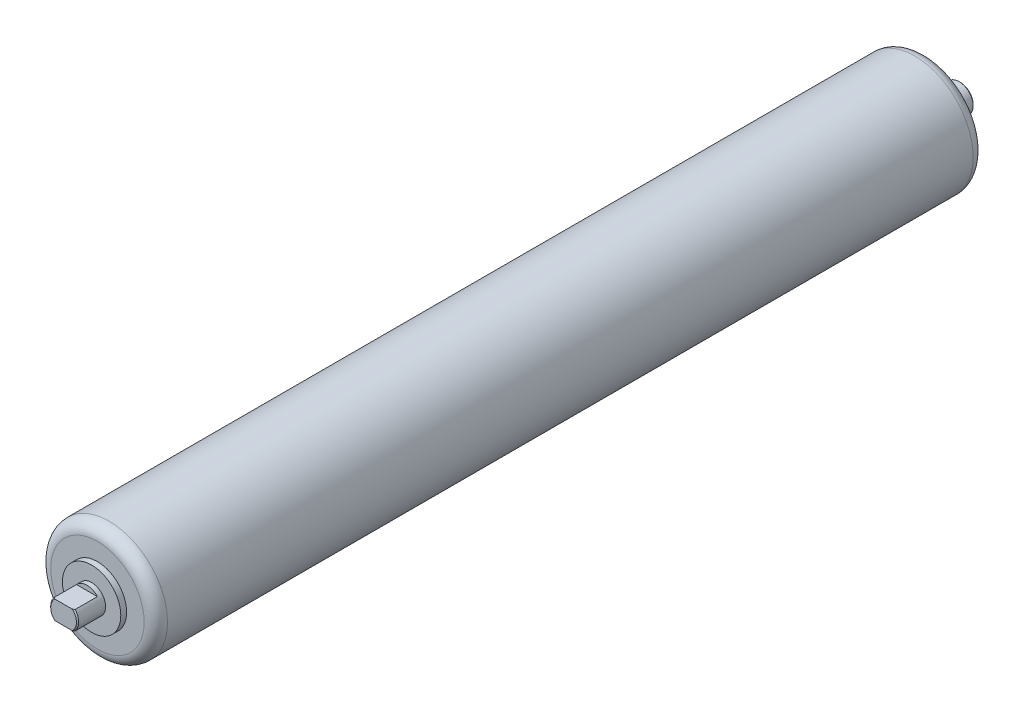
ISO-10303-21;
HEADER;
FILE_DESCRIPTION(('STEP AP214'),'2;1');
FILE_NAME('part.step','',(''),(''),'','','');
FILE_SCHEMA(('AUTOMOTIVE_DESIGN { 1 0 10303 214 1 1 1 1 }'));
ENDSEC;
DATA;
#1=APPLICATION_CONTEXT('core data for automotive mechanical design processes');
#2=APPLICATION_PROTOCOL_DEFINITION('international standard','automotive_design',2000,#1);
#3=PRODUCT_CONTEXT('',#1,'mechanical');
#4=PRODUCT('Part','Part','',(#3));
#5=PRODUCT_RELATED_PRODUCT_CATEGORY('part','',(#4));
#6=PRODUCT_DEFINITION_FORMATION('','',#4);
#7=PRODUCT_DEFINITION_CONTEXT('part definition',#1,'design');
#8=PRODUCT_DEFINITION('design','',#6,#7);
#9=PRODUCT_DEFINITION_SHAPE('','',#8);
#10=(LENGTH_UNIT() NAMED_UNIT(*) SI_UNIT(.MILLI.,.METRE.));
#11=(NAMED_UNIT(*) PLANE_ANGLE_UNIT() SI_UNIT($,.RADIAN.));
#12=(NAMED_UNIT(*) SI_UNIT($,.STERADIAN.) SOLID_ANGLE_UNIT());
#13=UNCERTAINTY_MEASURE_WITH_UNIT(LENGTH_MEASURE(1.E-05),#10,'distance_accuracy_value','');
#14=(GEOMETRIC_REPRESENTATION_CONTEXT(3) GLOBAL_UNCERTAINTY_ASSIGNED_CONTEXT((#13)) GLOBAL_UNIT_ASSIGNED_CONTEXT((#10,
#11,#12)) REPRESENTATION_CONTEXT('',''));
#15=CARTESIAN_POINT('',(0.,0.,0.));
#16=DIRECTION('',(0.,0.,1.));
#17=DIRECTION('',(1.,0.,0.));
#18=AXIS2_PLACEMENT_3D('',#15,#16,#17);
#19=CARTESIAN_POINT('',(0.,0.,-14.4999999999504));
#20=DIRECTION('',(0.,0.,1.));
#21=DIRECTION('',(1.,0.,0.));
#22=AXIS2_PLACEMENT_3D('',#19,#20,#21);
#23=CYLINDRICAL_SURFACE('',#22,5.99999999996344);
#24=CARTESIAN_POINT('',(0.,0.,357.50000000002));
#25=DIRECTION('',(0.,0.,1.));
#26=DIRECTION('',(1.,0.,0.));
#27=AXIS2_PLACEMENT_3D('',#24,#25,#26);
#28=CIRCLE('',#27,5.99999999996344);
#29=CARTESIAN_POINT('',(5.99999999996344,0.,357.50000000002));
#30=VERTEX_POINT('',#29);
#31=EDGE_CURVE('E153',#30,#30,#28,.T.);
#32=ORIENTED_EDGE('',*,*,#31,.T.);
#33=EDGE_LOOP('',(#32));
#34=FACE_BOUND('',#33,.T.);
#35=CARTESIAN_POINT('',(0.,0.,369.00000000002));
#36=DIRECTION('',(0.,0.,1.));
#37=DIRECTION('',(1.,0.,0.));
#38=AXIS2_PLACEMENT_3D('',#35,#36,#37);
#39=CIRCLE('',#38,5.99999999996344);
#40=CARTESIAN_POINT('',(4.47213595495053,-4.,369.00000000002));
#41=VERTEX_POINT('',#40);
#42=CARTESIAN_POINT('',(4.47213595495053,4.,369.00000000002));
#43=VERTEX_POINT('',#42);
#44=EDGE_CURVE('E150',#41,#43,#39,.T.);
#45=ORIENTED_EDGE('',*,*,#44,.F.);
#46=DIRECTION('',(0.,0.,1.));
#47=VECTOR('',#46,1.);
#48=CARTESIAN_POINT('',(4.47213595495053,-4.,359.5));
#49=LINE('',#48,#47);
#50=CARTESIAN_POINT('',(4.47213595495053,-4.,359.5));
#51=VERTEX_POINT('',#50);
#52=EDGE_CURVE('E94',#51,#41,#49,.T.);
#53=ORIENTED_EDGE('',*,*,#52,.F.);
#54=CARTESIAN_POINT('',(0.,0.,359.5));
#55=DIRECTION('',(0.,0.,1.));
#56=DIRECTION('',(1.,0.,0.));
#57=AXIS2_PLACEMENT_3D('',#54,#55,#56);
#58=CIRCLE('',#57,5.99999999996344);
#59=CARTESIAN_POINT('',(-4.47213595495053,-4.,359.5));
#60=VERTEX_POINT('',#59);
#61=EDGE_CURVE('E95',#60,#51,#58,.T.);
#62=ORIENTED_EDGE('',*,*,#61,.F.);
#63=DIRECTION('',(0.,0.,1.));
#64=VECTOR('',#63,1.);
#65=CARTESIAN_POINT('',(-4.47213595495053,-4.,359.5));
#66=LINE('',#65,#64);
#67=CARTESIAN_POINT('',(-4.47213595495053,-4.,369.00000000002));
#68=VERTEX_POINT('',#67);
#69=EDGE_CURVE('E83',#60,#68,#66,.T.);
#70=ORIENTED_EDGE('',*,*,#69,.T.);
#71=CARTESIAN_POINT('',(-4.47213595495053,4.,369.00000000002));
#72=VERTEX_POINT('',#71);
#73=EDGE_CURVE('E151',#72,#68,#39,.T.);
#74=ORIENTED_EDGE('',*,*,#73,.F.);
#75=DIRECTION('',(0.,0.,1.));
#76=VECTOR('',#75,1.);
#77=CARTESIAN_POINT('',(-4.47213595495053,4.,359.5));
#78=LINE('',#77,#76);
#79=CARTESIAN_POINT('',(-4.47213595495053,4.,359.5));
#80=VERTEX_POINT('',#79);
#81=EDGE_CURVE('E140',#80,#72,#78,.T.);
#82=ORIENTED_EDGE('',*,*,#81,.F.);
#83=CARTESIAN_POINT('',(0.,0.,359.5));
#84=DIRECTION('',(0.,0.,1.));
#85=DIRECTION('',(1.,0.,0.));
#86=AXIS2_PLACEMENT_3D('',#83,#84,#85);
#87=CIRCLE('',#86,5.99999999996344);
#88=CARTESIAN_POINT('',(4.47213595495053,4.,359.5));
#89=VERTEX_POINT('',#88);
#90=EDGE_CURVE('E195',#89,#80,#87,.T.);
#91=ORIENTED_EDGE('',*,*,#90,.F.);
#92=DIRECTION('',(0.,0.,1.));
#93=VECTOR('',#92,1.);
#94=CARTESIAN_POINT('',(4.47213595495053,4.,359.5));
#95=LINE('',#94,#93);
#96=EDGE_CURVE('E141',#89,#43,#95,.T.);
#97=ORIENTED_EDGE('',*,*,#96,.T.);
#98=EDGE_LOOP('',(#45,#53,#62,#70,#74,#82,#91,#97));
#99=FACE_BOUND('',#98,.T.);
#100=ADVANCED_FACE('F32',(#34,#99),#23,.T.);
#101=CARTESIAN_POINT('',(0.,0.,369.5));
#102=DIRECTION('',(0.,0.,-1.));
#103=DIRECTION('',(-1.,0.,0.));
#104=AXIS2_PLACEMENT_3D('',#101,#102,#103);
#105=CONICAL_SURFACE('',#104,5.49999999998363,0.785398163397462);
#106=ORIENTED_EDGE('',*,*,#73,.T.);
#107=CARTESIAN_POINT('',(-9.84727781504175,-4.,364.371318032467));
#108=CARTESIAN_POINT('',(-9.69922324885949,-4.,364.508485454713));
#109=CARTESIAN_POINT('',(-9.55095295870481,-4.,364.645419932956));
#110=CARTESIAN_POINT('',(-9.25391590392168,-4.,364.918751408983));
#111=CARTESIAN_POINT('',(-9.10514913573849,-4.,365.055148402904));
#112=CARTESIAN_POINT('',(-8.65794578030058,-4.,365.463481241758));
#113=CARTESIAN_POINT('',(-8.35866964549407,-4.,365.734499996849));
#114=CARTESIAN_POINT('',(-7.75538362207273,-4.,366.274871556237));
#115=CARTESIAN_POINT('',(-7.45135613683975,-4.,366.544204744555));
#116=CARTESIAN_POINT('',(-6.83932495329541,-4.,367.078262902102));
#117=CARTESIAN_POINT('',(-6.53132172715134,-4.,367.342988409935));
#118=CARTESIAN_POINT('',(-5.97207069090468,-4.,367.813371406714));
#119=CARTESIAN_POINT('',(-5.72183140217737,-4.,368.020225645294));
#120=CARTESIAN_POINT('',(-5.21651658532711,-4.,368.428115540013));
#121=CARTESIAN_POINT('',(-4.96143990579113,-4.,368.629149781342));
#122=CARTESIAN_POINT('',(-4.57409164576276,-4.,368.924195894457));
#123=CARTESIAN_POINT('',(-4.44425921940145,-4.,369.021408831467));
#124=CARTESIAN_POINT('',(-4.18267788053479,-4.,369.213216387911));
#125=CARTESIAN_POINT('',(-4.050929057644,-4.,369.307811129181));
#126=CARTESIAN_POINT('',(-3.78521936713537,-4.,369.49374156175));
#127=CARTESIAN_POINT('',(-3.65125936627372,-4.,369.585078487689));
#128=CARTESIAN_POINT('',(-3.38068251661969,-4.,369.763714695958));
#129=CARTESIAN_POINT('',(-3.24406596338739,-4.,369.851014423845));
#130=CARTESIAN_POINT('',(-2.97175006223087,-4.,370.01802517323));
#131=CARTESIAN_POINT('',(-2.83614173218697,-4.,370.097883809019));
#132=CARTESIAN_POINT('',(-2.561470492955,-4.,370.251509073686));
#133=CARTESIAN_POINT('',(-2.42240719963654,-4.,370.325275021185));
#134=CARTESIAN_POINT('',(-2.14046358132059,-4.,370.4649589796));
#135=CARTESIAN_POINT('',(-1.99758562509169,-4.,370.530881728187));
#136=CARTESIAN_POINT('',(-1.70761023519236,-4.,370.652742806207));
#137=CARTESIAN_POINT('',(-1.56051400045903,-4.,370.708683940641));
#138=CARTESIAN_POINT('',(-1.29474501959874,-4.,370.797109149484));
#139=CARTESIAN_POINT('',(-1.1768935990225,-4.,370.832047580014));
#140=CARTESIAN_POINT('',(-0.938895023679079,-4.,370.892895834929));
#141=CARTESIAN_POINT('',(-0.818748732135697,-4.,370.918808986307));
#142=CARTESIAN_POINT('',(-0.577056553718051,-4.,370.96033686039));
#143=CARTESIAN_POINT('',(-0.455516321692243,-4.,370.975984019309));
#144=CARTESIAN_POINT('',(-0.211511659012292,-4.,370.996256247968));
#145=CARTESIAN_POINT('',(-0.0890472826007137,-4.,371.000881959639));
#146=CARTESIAN_POINT('',(0.156128849381338,-4.,370.998836806745));
#147=CARTESIAN_POINT('',(0.278840337138834,-4.,370.992134266363));
#148=CARTESIAN_POINT('',(0.523161049287287,-4.,370.967765844794));
#149=CARTESIAN_POINT('',(0.644770185787147,-4.,370.950099097091));
#150=CARTESIAN_POINT('',(0.886455531695206,-4.,370.904678254862));
#151=CARTESIAN_POINT('',(1.00652576135002,-4.,370.876892802215));
#152=CARTESIAN_POINT('',(1.24425359281922,-4.,370.812511088071));
#153=CARTESIAN_POINT('',(1.36191108250651,-4.,370.775914418093));
#154=CARTESIAN_POINT('',(1.60761556923946,-4.,370.690742861667));
#155=CARTESIAN_POINT('',(1.73535440248294,-4.,370.64128646037));
#156=CARTESIAN_POINT('',(1.9876595360213,-4.,370.534834983038));
#157=CARTESIAN_POINT('',(2.11222486413368,-4.,370.477837629226));
#158=CARTESIAN_POINT('',(2.35857898365496,-4.,370.357660910831));
#159=CARTESIAN_POINT('',(2.48036263914519,-4.,370.2944710972));
#160=CARTESIAN_POINT('',(2.72121590527681,-4.,370.163180169232));
#161=CARTESIAN_POINT('',(2.84028585695764,-4.,370.095079676565));
#162=CARTESIAN_POINT('',(3.07752874506887,-4.,369.954014425935));
#163=CARTESIAN_POINT('',(3.19567158353317,-4.,369.8809992772));
#164=CARTESIAN_POINT('',(3.4298284282467,-4.,369.731640595838));
#165=CARTESIAN_POINT('',(3.54584238599126,-4.,369.655296987508));
#166=CARTESIAN_POINT('',(3.89089542794863,-4.,369.422351339129));
#167=CARTESIAN_POINT('',(4.11718955919668,-4.,369.261686067973));
#168=CARTESIAN_POINT('',(4.59152781988416,-4.,368.912857016538));
#169=CARTESIAN_POINT('',(4.838855939965,-4.,368.723730231355));
#170=CARTESIAN_POINT('',(5.32842819205849,-4.,368.338972268687));
#171=CARTESIAN_POINT('',(5.57067161483685,-4.,368.143340193525));
#172=CARTESIAN_POINT('',(6.05152992360446,-4.,367.747245621479));
#173=CARTESIAN_POINT('',(6.29014131591775,-4.,367.546778900696));
#174=CARTESIAN_POINT('',(6.76441956417073,-4.,367.142389646707));
#175=CARTESIAN_POINT('',(7.0000863509174,-4.,366.938467032558));
#176=CARTESIAN_POINT('',(7.45569160882467,-4.,366.539745170844));
#177=CARTESIAN_POINT('',(7.67575813548737,-4.,366.345091951776));
#178=CARTESIAN_POINT('',(8.11424925294544,-4.,365.953938206805));
#179=CARTESIAN_POINT('',(8.33267381146453,-4.,365.757437644757));
#180=CARTESIAN_POINT('',(8.76775983008864,-4.,365.3633454547));
#181=CARTESIAN_POINT('',(8.98442389821555,-4.,365.165756702561));
#182=CARTESIAN_POINT('',(9.41663244459867,-4.,364.769376626648));
#183=CARTESIAN_POINT('',(9.63217697068224,-4.,364.570585355044));
#184=CARTESIAN_POINT('',(9.84727781504174,-4.,364.371318032467));
#185=B_SPLINE_CURVE_WITH_KNOTS('',3,(#107,#108,#109,#110,#111,#112,#113,#114,#115,#116,#117,
#118,#119,#120,#121,#122,#123,#124,#125,#126,#127,#128,#129,#130,#131,#132,#133,#134,#135,#136,
#137,#138,#139,#140,#141,#142,#143,#144,#145,#146,#147,#148,#149,#150,#151,#152,#153,#154,#155,
#156,#157,#158,#159,#160,#161,#162,#163,#164,#165,#166,#167,#168,#169,#170,#171,#172,#173,#174,
#175,#176,#177,#178,#179,#180,#181,#182,#183,#184),.UNSPECIFIED.,.F.,.F.,(4,2,2,2,2,2,2,2,2,2,2,
2,2,2,2,2,2,2,2,2,2,2,2,2,2,2,2,2,2,2,2,2,2,2,2,2,2,2,4),(0.,0.605487251745943,1.21097884806759,
2.42222197017365,3.64069890696268,4.85903244249096,5.83297744055653,6.8071572447625,
7.29371349960265,7.7802470747745,8.26659426194909,8.75288764571488,9.22489098800301,
9.6969470456024,10.168716494987,10.6403531596795,11.008816954263,11.3771447778034,
11.7443031633023,12.1114401635463,12.4796054436928,12.8477998241426,13.2171450957548,
13.5865074932033,13.9971432861428,14.4079033977954,14.819368960879,15.2307825254635,
15.6473684942298,16.0639639427859,16.8962993776668,17.8302132352301,18.7642565046844,
19.6991477117597,20.6340608459618,21.5154520354615,22.3968605054628,23.2765497071862,
24.1562010138815),.UNSPECIFIED.);
#186=CARTESIAN_POINT('',(-3.77491721761152,-4.,369.5));
#187=VERTEX_POINT('',#186);
#188=EDGE_CURVE('E89',#68,#187,#185,.T.);
#189=ORIENTED_EDGE('',*,*,#188,.T.);
#190=CARTESIAN_POINT('',(0.,0.,369.5));
#191=DIRECTION('',(0.,0.,1.));
#192=DIRECTION('',(1.,0.,0.));
#193=AXIS2_PLACEMENT_3D('',#190,#191,#192);
#194=CIRCLE('',#193,5.49999999998363);
#195=CARTESIAN_POINT('',(-3.77491721761152,4.,369.5));
#196=VERTEX_POINT('',#195);
#197=EDGE_CURVE('E147',#196,#187,#194,.T.);
#198=ORIENTED_EDGE('',*,*,#197,.F.);
#199=CARTESIAN_POINT('',(-9.84727781504175,4.,364.371318032467));
#200=CARTESIAN_POINT('',(-9.69922324885949,4.,364.508485454713));
#201=CARTESIAN_POINT('',(-9.55095295870481,4.,364.645419932956));
#202=CARTESIAN_POINT('',(-9.25391590392168,4.,364.918751408983));
#203=CARTESIAN_POINT('',(-9.10514913573849,4.,365.055148402904));
#204=CARTESIAN_POINT('',(-8.65794578030058,4.,365.463481241758));
#205=CARTESIAN_POINT('',(-8.35866964549407,4.,365.734499996849));
#206=CARTESIAN_POINT('',(-7.75538362207273,4.,366.274871556237));
#207=CARTESIAN_POINT('',(-7.45135613683975,4.,366.544204744555));
#208=CARTESIAN_POINT('',(-6.83932495329541,4.,367.078262902102));
#209=CARTESIAN_POINT('',(-6.53132172715134,4.,367.342988409935));
#210=CARTESIAN_POINT('',(-5.97207069090468,4.,367.813371406714));
#211=CARTESIAN_POINT('',(-5.72183140217737,4.,368.020225645294));
#212=CARTESIAN_POINT('',(-5.21651658532711,4.,368.428115540013));
#213=CARTESIAN_POINT('',(-4.96143990579113,4.,368.629149781342));
#214=CARTESIAN_POINT('',(-4.57409164576276,4.,368.924195894457));
#215=CARTESIAN_POINT('',(-4.44425921940145,4.,369.021408831467));
#216=CARTESIAN_POINT('',(-4.18267788053479,4.,369.213216387911));
#217=CARTESIAN_POINT('',(-4.050929057644,4.,369.307811129181));
#218=CARTESIAN_POINT('',(-3.78521936713537,4.,369.49374156175));
#219=CARTESIAN_POINT('',(-3.65125936627372,4.,369.585078487689));
#220=CARTESIAN_POINT('',(-3.38068251661969,4.,369.763714695958));
#221=CARTESIAN_POINT('',(-3.24406596338739,4.,369.851014423845));
#222=CARTESIAN_POINT('',(-2.97175006223087,4.,370.01802517323));
#223=CARTESIAN_POINT('',(-2.83614173218697,4.,370.097883809019));
#224=CARTESIAN_POINT('',(-2.561470492955,4.,370.251509073686));
#225=CARTESIAN_POINT('',(-2.42240719963654,4.,370.325275021185));
#226=CARTESIAN_POINT('',(-2.14046358132059,4.,370.4649589796));
#227=CARTESIAN_POINT('',(-1.99758562509169,4.,370.530881728187));
#228=CARTESIAN_POINT('',(-1.70761023519236,4.,370.652742806207));
#229=CARTESIAN_POINT('',(-1.56051400045903,4.,370.708683940641));
#230=CARTESIAN_POINT('',(-1.29474501959874,4.,370.797109149484));
#231=CARTESIAN_POINT('',(-1.1768935990225,4.,370.832047580014));
#232=CARTESIAN_POINT('',(-0.938895023679079,4.,370.892895834929));
#233=CARTESIAN_POINT('',(-0.818748732135697,4.,370.918808986307));
#234=CARTESIAN_POINT('',(-0.577056553718051,4.,370.96033686039));
#235=CARTESIAN_POINT('',(-0.455516321692243,4.,370.975984019309));
#236=CARTESIAN_POINT('',(-0.211511659012292,4.,370.996256247968));
#237=CARTESIAN_POINT('',(-0.0890472826007137,4.,371.000881959639));
#238=CARTESIAN_POINT('',(0.156128849381338,4.,370.998836806745));
#239=CARTESIAN_POINT('',(0.278840337138834,4.,370.992134266363));
#240=CARTESIAN_POINT('',(0.523161049287287,4.,370.967765844794));
#241=CARTESIAN_POINT('',(0.644770185787147,4.,370.950099097091));
#242=CARTESIAN_POINT('',(0.886455531695206,4.,370.904678254862));
#243=CARTESIAN_POINT('',(1.00652576135002,4.,370.876892802215));
#244=CARTESIAN_POINT('',(1.24425359281922,4.,370.812511088071));
#245=CARTESIAN_POINT('',(1.36191108250651,4.,370.775914418093));
#246=CARTESIAN_POINT('',(1.60761556923946,4.,370.690742861667));
#247=CARTESIAN_POINT('',(1.73535440248294,4.,370.64128646037));
#248=CARTESIAN_POINT('',(1.9876595360213,4.,370.534834983038));
#249=CARTESIAN_POINT('',(2.11222486413368,4.,370.477837629226));
#250=CARTESIAN_POINT('',(2.35857898365496,4.,370.357660910831));
#251=CARTESIAN_POINT('',(2.48036263914519,4.,370.2944710972));
#252=CARTESIAN_POINT('',(2.72121590527681,4.,370.163180169232));
#253=CARTESIAN_POINT('',(2.84028585695764,4.,370.095079676565));
#254=CARTESIAN_POINT('',(3.07752874506887,4.,369.954014425935));
#255=CARTESIAN_POINT('',(3.19567158353317,4.,369.8809992772));
#256=CARTESIAN_POINT('',(3.4298284282467,4.,369.731640595838));
#257=CARTESIAN_POINT('',(3.54584238599126,4.,369.655296987508));
#258=CARTESIAN_POINT('',(3.89089542794863,4.,369.422351339129));
#259=CARTESIAN_POINT('',(4.11718955919668,4.,369.261686067973));
#260=CARTESIAN_POINT('',(4.59152781988416,4.,368.912857016538));
#261=CARTESIAN_POINT('',(4.838855939965,4.,368.723730231355));
#262=CARTESIAN_POINT('',(5.32842819205849,4.,368.338972268687));
#263=CARTESIAN_POINT('',(5.57067161483685,4.,368.143340193525));
#264=CARTESIAN_POINT('',(6.05152992360446,4.,367.747245621479));
#265=CARTESIAN_POINT('',(6.29014131591775,4.,367.546778900696));
#266=CARTESIAN_POINT('',(6.76441956417073,4.,367.142389646707));
#267=CARTESIAN_POINT('',(7.0000863509174,4.,366.938467032558));
#268=CARTESIAN_POINT('',(7.45569160882467,4.,366.539745170844));
#269=CARTESIAN_POINT('',(7.67575813548737,4.,366.345091951776));
#270=CARTESIAN_POINT('',(8.11424925294544,4.,365.953938206805));
#271=CARTESIAN_POINT('',(8.33267381146453,4.,365.757437644757));
#272=CARTESIAN_POINT('',(8.76775983008864,4.,365.3633454547));
#273=CARTESIAN_POINT('',(8.98442389821555,4.,365.165756702561));
#274=CARTESIAN_POINT('',(9.41663244459867,4.,364.769376626648));
#275=CARTESIAN_POINT('',(9.63217697068224,4.,364.570585355044));
#276=CARTESIAN_POINT('',(9.84727781504174,4.,364.371318032467));
#277=B_SPLINE_CURVE_WITH_KNOTS('',3,(#199,#200,#201,#202,#203,#204,#205,#206,#207,#208,#209,
#210,#211,#212,#213,#214,#215,#216,#217,#218,#219,#220,#221,#222,#223,#224,#225,#226,#227,#228,
#229,#230,#231,#232,#233,#234,#235,#236,#237,#238,#239,#240,#241,#242,#243,#244,#245,#246,#247,
#248,#249,#250,#251,#252,#253,#254,#255,#256,#257,#258,#259,#260,#261,#262,#263,#264,#265,#266,
#267,#268,#269,#270,#271,#272,#273,#274,#275,#276),.UNSPECIFIED.,.F.,.F.,(4,2,2,2,2,2,2,2,2,2,2,
2,2,2,2,2,2,2,2,2,2,2,2,2,2,2,2,2,2,2,2,2,2,2,2,2,2,2,4),(0.,0.605487251745943,1.21097884806759,
2.42222197017365,3.64069890696268,4.85903244249096,5.83297744055653,6.8071572447625,
7.29371349960265,7.7802470747745,8.26659426194909,8.75288764571488,9.22489098800301,
9.6969470456024,10.168716494987,10.6403531596795,11.008816954263,11.3771447778034,
11.7443031633023,12.1114401635463,12.4796054436928,12.8477998241426,13.2171450957548,
13.5865074932033,13.9971432861428,14.4079033977954,14.819368960879,15.2307825254635,
15.6473684942298,16.0639639427859,16.8962993776668,17.8302132352301,18.7642565046844,
19.6991477117597,20.6340608459618,21.5154520354615,22.3968605054628,23.2765497071862,
24.1562010138815),.UNSPECIFIED.);
#278=EDGE_CURVE('E54',#72,#196,#277,.T.);
#279=ORIENTED_EDGE('',*,*,#278,.F.);
#280=EDGE_LOOP('',(#106,#189,#198,#279));
#281=FACE_BOUND('',#280,.T.);
#282=ADVANCED_FACE('F114',(#281),#105,.T.);
#283=CARTESIAN_POINT('',(3.77491721761152,-4.,369.5));
#284=VERTEX_POINT('',#283);
#285=CARTESIAN_POINT('',(3.77491721761152,4.,369.5));
#286=VERTEX_POINT('',#285);
#287=EDGE_CURVE('E146',#284,#286,#194,.T.);
#288=ORIENTED_EDGE('',*,*,#287,.F.);
#289=EDGE_CURVE('E47',#284,#41,#185,.T.);
#290=ORIENTED_EDGE('',*,*,#289,.T.);
#291=ORIENTED_EDGE('',*,*,#44,.T.);
#292=EDGE_CURVE('E132',#286,#43,#277,.T.);
#293=ORIENTED_EDGE('',*,*,#292,.F.);
#294=EDGE_LOOP('',(#288,#290,#291,#293));
#295=FACE_BOUND('',#294,.T.);
#296=ADVANCED_FACE('F191',(#295),#105,.T.);
#297=CARTESIAN_POINT('',(0.,0.,369.5));
#298=DIRECTION('',(0.,0.,1.));
#299=DIRECTION('',(1.,0.,0.));
#300=AXIS2_PLACEMENT_3D('',#297,#298,#299);
#301=PLANE('',#300);
#302=ORIENTED_EDGE('',*,*,#197,.T.);
#303=DIRECTION('',(1.,0.,0.));
#304=VECTOR('',#303,1.);
#305=CARTESIAN_POINT('',(0.,-4.,369.5));
#306=LINE('',#305,#304);
#307=EDGE_CURVE('E11',#187,#284,#306,.T.);
#308=ORIENTED_EDGE('',*,*,#307,.T.);
#309=ORIENTED_EDGE('',*,*,#287,.T.);
#310=DIRECTION('',(1.,0.,0.));
#311=VECTOR('',#310,1.);
#312=CARTESIAN_POINT('',(0.,4.,369.5));
#313=LINE('',#312,#311);
#314=EDGE_CURVE('E40',#196,#286,#313,.T.);
#315=ORIENTED_EDGE('',*,*,#314,.F.);
#316=EDGE_LOOP('',(#302,#308,#309,#315));
#317=FACE_BOUND('',#316,.T.);
#318=ADVANCED_FACE('F198',(#317),#301,.T.);
#319=CARTESIAN_POINT('',(0.,0.,-13.9999999999797));
#320=DIRECTION('',(0.,0.,1.));
#321=DIRECTION('',(1.,0.,0.));
#322=AXIS2_PLACEMENT_3D('',#319,#320,#321);
#323=CONICAL_SURFACE('',#322,5.99999999996348,0.785398163397448);
#324=CARTESIAN_POINT('',(0.,0.,-14.4999999999504));
#325=DIRECTION('',(0.,0.,1.));
#326=DIRECTION('',(1.,0.,0.));
#327=AXIS2_PLACEMENT_3D('',#324,#325,#326);
#328=CIRCLE('',#327,5.49999999999273);
#329=CARTESIAN_POINT('',(5.49999999999269,0.,-14.4999999999504));
#330=VERTEX_POINT('',#329);
#331=EDGE_CURVE('E143',#330,#330,#328,.T.);
#332=ORIENTED_EDGE('',*,*,#331,.T.);
#333=EDGE_LOOP('',(#332));
#334=FACE_BOUND('',#333,.T.);
#335=CARTESIAN_POINT('',(0.,0.,-13.9999999999797));
#336=DIRECTION('',(0.,0.,1.));
#337=DIRECTION('',(1.,0.,0.));
#338=AXIS2_PLACEMENT_3D('',#335,#336,#337);
#339=CIRCLE('',#338,5.99999999996348);
#340=CARTESIAN_POINT('',(5.99999999996344,0.,-13.9999999999797));
#341=VERTEX_POINT('',#340);
#342=EDGE_CURVE('E171',#341,#341,#339,.T.);
#343=ORIENTED_EDGE('',*,*,#342,.F.);
#344=EDGE_LOOP('',(#343));
#345=FACE_BOUND('',#344,.T.);
#346=ADVANCED_FACE('F200',(#334,#345),#323,.T.);
#347=CARTESIAN_POINT('',(0.,0.,-14.4999999999504));
#348=DIRECTION('',(0.,0.,1.));
#349=DIRECTION('',(1.,0.,0.));
#350=AXIS2_PLACEMENT_3D('',#347,#348,#349);
#351=CYLINDRICAL_SURFACE('',#350,5.99999999996348);
#352=ORIENTED_EDGE('',*,*,#342,.T.);
#353=EDGE_LOOP('',(#352));
#354=FACE_BOUND('',#353,.T.);
#355=CARTESIAN_POINT('',(0.,0.,-2.49999999997975));
#356=DIRECTION('',(0.,0.,1.));
#357=DIRECTION('',(1.,0.,0.));
#358=AXIS2_PLACEMENT_3D('',#355,#356,#357);
#359=CIRCLE('',#358,5.99999999996348);
#360=CARTESIAN_POINT('',(5.99999999996344,0.,-2.49999999997976));
#361=VERTEX_POINT('',#360);
#362=EDGE_CURVE('E168',#361,#361,#359,.T.);
#363=ORIENTED_EDGE('',*,*,#362,.F.);
#364=EDGE_LOOP('',(#363));
#365=FACE_BOUND('',#364,.T.);
#366=ADVANCED_FACE('F205',(#354,#365),#351,.T.);
#367=CARTESIAN_POINT('',(12.4999999999634,0.,-2.49999999997976));
#368=DIRECTION('',(0.,0.,-1.));
#369=DIRECTION('',(-1.,0.,0.));
#370=AXIS2_PLACEMENT_3D('',#367,#368,#369);
#371=PLANE('',#370);
#372=ORIENTED_EDGE('',*,*,#362,.T.);
#373=EDGE_LOOP('',(#372));
#374=FACE_BOUND('',#373,.T.);
#375=CARTESIAN_POINT('',(0.,0.,-2.49999999997975));
#376=DIRECTION('',(0.,0.,1.));
#377=DIRECTION('',(1.,0.,0.));
#378=AXIS2_PLACEMENT_3D('',#375,#376,#377);
#379=CIRCLE('',#378,12.4999999999635);
#380=CARTESIAN_POINT('',(12.4999999999634,0.,-2.49999999997976));
#381=VERTEX_POINT('',#380);
#382=EDGE_CURVE('E165',#381,#381,#379,.T.);
#383=ORIENTED_EDGE('',*,*,#382,.F.);
#384=EDGE_LOOP('',(#383));
#385=FACE_BOUND('',#384,.T.);
#386=ADVANCED_FACE('F237',(#374,#385),#371,.T.);
#387=CARTESIAN_POINT('',(0.,0.,-14.4999999999504));
#388=DIRECTION('',(0.,0.,1.));
#389=DIRECTION('',(1.,0.,0.));
#390=AXIS2_PLACEMENT_3D('',#387,#388,#389);
#391=CYLINDRICAL_SURFACE('',#390,12.4999999999635);
#392=ORIENTED_EDGE('',*,*,#382,.T.);
#393=EDGE_LOOP('',(#392));
#394=FACE_BOUND('',#393,.T.);
#395=CARTESIAN_POINT('',(0.,0.,2.02494271350773E-11));
#396=DIRECTION('',(0.,0.,1.));
#397=DIRECTION('',(1.,0.,0.));
#398=AXIS2_PLACEMENT_3D('',#395,#396,#397);
#399=CIRCLE('',#398,12.4999999999635);
#400=CARTESIAN_POINT('',(12.4999999999634,0.,2.02479024757722E-11));
#401=VERTEX_POINT('',#400);
#402=EDGE_CURVE('E162',#401,#401,#399,.T.);
#403=ORIENTED_EDGE('',*,*,#402,.F.);
#404=EDGE_LOOP('',(#403));
#405=FACE_BOUND('',#404,.T.);
#406=ADVANCED_FACE('F233',(#394,#405),#391,.T.);
#407=CARTESIAN_POINT('',(24.9999999999634,0.,2.02461484860978E-11));
#408=DIRECTION('',(0.,0.,-1.));
#409=DIRECTION('',(-1.,0.,0.));
#410=AXIS2_PLACEMENT_3D('',#407,#408,#409);
#411=PLANE('',#410);
#412=CARTESIAN_POINT('',(0.,0.,2.02494271350773E-11));
#413=DIRECTION('',(0.,0.,-1.));
#414=DIRECTION('',(-1.,0.,0.));
#415=AXIS2_PLACEMENT_3D('',#412,#413,#414);
#416=CIRCLE('',#415,19.9999999999635);
#417=CARTESIAN_POINT('',(-19.9999999999635,0.,2.02518665899654E-11));
#418=VERTEX_POINT('',#417);
#419=EDGE_CURVE('E183',#418,#418,#416,.T.);
#420=ORIENTED_EDGE('',*,*,#419,.T.);
#421=EDGE_LOOP('',(#420));
#422=FACE_BOUND('',#421,.T.);
#423=ORIENTED_EDGE('',*,*,#402,.T.);
#424=EDGE_LOOP('',(#423));
#425=FACE_BOUND('',#424,.T.);
#426=ADVANCED_FACE('F229',(#422,#425),#411,.T.);
#427=CARTESIAN_POINT('',(0.,0.,-14.4999999999504));
#428=DIRECTION('',(0.,0.,1.));
#429=DIRECTION('',(1.,0.,0.));
#430=AXIS2_PLACEMENT_3D('',#427,#428,#429);
#431=CYLINDRICAL_SURFACE('',#430,24.9999999999635);
#432=CARTESIAN_POINT('',(0.,0.,350.00000000002));
#433=DIRECTION('',(0.,0.,1.));
#434=DIRECTION('',(1.,0.,0.));
#435=AXIS2_PLACEMENT_3D('',#432,#433,#434);
#436=CIRCLE('',#435,24.9999999999635);
#437=CARTESIAN_POINT('',(24.9999999999635,0.,350.00000000002));
#438=VERTEX_POINT('',#437);
#439=EDGE_CURVE('E180',#438,#438,#436,.F.);
#440=ORIENTED_EDGE('',*,*,#439,.T.);
#441=EDGE_LOOP('',(#440));
#442=FACE_BOUND('',#441,.T.);
#443=CARTESIAN_POINT('',(0.,0.,5.00000000002025));
#444=DIRECTION('',(0.,0.,-1.));
#445=DIRECTION('',(-1.,0.,0.));
#446=AXIS2_PLACEMENT_3D('',#443,#444,#445);
#447=CIRCLE('',#446,24.9999999999635);
#448=CARTESIAN_POINT('',(-24.9999999999635,0.,5.00000000002025));
#449=VERTEX_POINT('',#448);
#450=EDGE_CURVE('E177',#449,#449,#447,.F.);
#451=ORIENTED_EDGE('',*,*,#450,.T.);
#452=EDGE_LOOP('',(#451));
#453=FACE_BOUND('',#452,.T.);
#454=ADVANCED_FACE('F225',(#442,#453),#431,.T.);
#455=CARTESIAN_POINT('',(12.4999999999634,0.,355.00000000002));
#456=DIRECTION('',(0.,0.,1.));
#457=DIRECTION('',(1.,0.,0.));
#458=AXIS2_PLACEMENT_3D('',#455,#456,#457);
#459=PLANE('',#458);
#460=CARTESIAN_POINT('',(0.,0.,355.00000000002));
#461=DIRECTION('',(0.,0.,1.));
#462=DIRECTION('',(1.,0.,0.));
#463=AXIS2_PLACEMENT_3D('',#460,#461,#462);
#464=CIRCLE('',#463,19.9999999999635);
#465=CARTESIAN_POINT('',(19.9999999999635,0.,355.00000000002));
#466=VERTEX_POINT('',#465);
#467=EDGE_CURVE('E174',#466,#466,#464,.T.);
#468=ORIENTED_EDGE('',*,*,#467,.T.);
#469=EDGE_LOOP('',(#468));
#470=FACE_BOUND('',#469,.T.);
#471=CARTESIAN_POINT('',(0.,0.,355.00000000002));
#472=DIRECTION('',(0.,0.,1.));
#473=DIRECTION('',(1.,0.,0.));
#474=AXIS2_PLACEMENT_3D('',#471,#472,#473);
#475=CIRCLE('',#474,12.4999999999634);
#476=CARTESIAN_POINT('',(12.4999999999634,0.,355.00000000002));
#477=VERTEX_POINT('',#476);
#478=EDGE_CURVE('E159',#477,#477,#475,.T.);
#479=ORIENTED_EDGE('',*,*,#478,.F.);
#480=EDGE_LOOP('',(#479));
#481=FACE_BOUND('',#480,.T.);
#482=ADVANCED_FACE('F221',(#470,#481),#459,.T.);
#483=CARTESIAN_POINT('',(0.,0.,-14.4999999999504));
#484=DIRECTION('',(0.,0.,1.));
#485=DIRECTION('',(1.,0.,0.));
#486=AXIS2_PLACEMENT_3D('',#483,#484,#485);
#487=CYLINDRICAL_SURFACE('',#486,12.4999999999634);
#488=ORIENTED_EDGE('',*,*,#478,.T.);
#489=EDGE_LOOP('',(#488));
#490=FACE_BOUND('',#489,.T.);
#491=CARTESIAN_POINT('',(0.,0.,357.50000000002));
#492=DIRECTION('',(0.,0.,1.));
#493=DIRECTION('',(1.,0.,0.));
#494=AXIS2_PLACEMENT_3D('',#491,#492,#493);
#495=CIRCLE('',#494,12.4999999999634);
#496=CARTESIAN_POINT('',(12.4999999999634,0.,357.50000000002));
#497=VERTEX_POINT('',#496);
#498=EDGE_CURVE('E156',#497,#497,#495,.T.);
#499=ORIENTED_EDGE('',*,*,#498,.F.);
#500=EDGE_LOOP('',(#499));
#501=FACE_BOUND('',#500,.T.);
#502=ADVANCED_FACE('F217',(#490,#501),#487,.T.);
#503=CARTESIAN_POINT('',(5.99999999996344,0.,357.50000000002));
#504=DIRECTION('',(0.,0.,1.));
#505=DIRECTION('',(1.,0.,0.));
#506=AXIS2_PLACEMENT_3D('',#503,#504,#505);
#507=PLANE('',#506);
#508=ORIENTED_EDGE('',*,*,#498,.T.);
#509=EDGE_LOOP('',(#508));
#510=FACE_BOUND('',#509,.T.);
#511=ORIENTED_EDGE('',*,*,#31,.F.);
#512=EDGE_LOOP('',(#511));
#513=FACE_BOUND('',#512,.T.);
#514=ADVANCED_FACE('F214',(#510,#513),#507,.T.);
#515=CARTESIAN_POINT('',(5.49999999999269,0.,-14.4999999999504));
#516=DIRECTION('',(0.,0.,-1.));
#517=DIRECTION('',(-1.,0.,0.));
#518=AXIS2_PLACEMENT_3D('',#515,#516,#517);
#519=PLANE('',#518);
#520=ORIENTED_EDGE('',*,*,#331,.F.);
#521=EDGE_LOOP('',(#520));
#522=FACE_BOUND('',#521,.T.);
#523=ADVANCED_FACE('F130',(#522),#519,.T.);
#524=CARTESIAN_POINT('',(0.,0.,350.00000000002));
#525=DIRECTION('',(0.,0.,1.));
#526=DIRECTION('',(1.,0.,0.));
#527=AXIS2_PLACEMENT_3D('',#524,#525,#526);
#528=TOROIDAL_SURFACE('',#527,19.9999999999635,5.);
#529=ORIENTED_EDGE('',*,*,#439,.F.);
#530=EDGE_LOOP('',(#529));
#531=FACE_BOUND('',#530,.T.);
#532=ORIENTED_EDGE('',*,*,#467,.F.);
#533=EDGE_LOOP('',(#532));
#534=FACE_BOUND('',#533,.T.);
#535=ADVANCED_FACE('F244',(#531,#534),#528,.T.);
#536=CARTESIAN_POINT('',(0.,0.,5.00000000002025));
#537=DIRECTION('',(0.,0.,-1.));
#538=DIRECTION('',(-1.,0.,0.));
#539=AXIS2_PLACEMENT_3D('',#536,#537,#538);
#540=TOROIDAL_SURFACE('',#539,19.9999999999635,5.);
#541=ORIENTED_EDGE('',*,*,#419,.F.);
#542=EDGE_LOOP('',(#541));
#543=FACE_BOUND('',#542,.T.);
#544=ORIENTED_EDGE('',*,*,#450,.F.);
#545=EDGE_LOOP('',(#544));
#546=FACE_BOUND('',#545,.T.);
#547=ADVANCED_FACE('F34',(#543,#546),#540,.T.);
#548=CARTESIAN_POINT('',(0.,4.,359.5));
#549=DIRECTION('',(0.,-1.,0.));
#550=DIRECTION('',(0.,0.,-1.));
#551=AXIS2_PLACEMENT_3D('',#548,#549,#550);
#552=PLANE('',#551);
#553=ORIENTED_EDGE('',*,*,#278,.T.);
#554=ORIENTED_EDGE('',*,*,#314,.T.);
#555=ORIENTED_EDGE('',*,*,#292,.T.);
#556=ORIENTED_EDGE('',*,*,#96,.F.);
#557=DIRECTION('',(1.,0.,0.));
#558=VECTOR('',#557,1.);
#559=CARTESIAN_POINT('',(0.,4.,359.5));
#560=LINE('',#559,#558);
#561=EDGE_CURVE('E112',#80,#89,#560,.T.);
#562=ORIENTED_EDGE('',*,*,#561,.F.);
#563=ORIENTED_EDGE('',*,*,#81,.T.);
#564=EDGE_LOOP('',(#553,#554,#555,#556,#562,#563));
#565=FACE_BOUND('',#564,.T.);
#566=ADVANCED_FACE('F125',(#565),#552,.F.);
#567=CARTESIAN_POINT('',(0.,0.,359.5));
#568=DIRECTION('',(0.,0.,1.));
#569=DIRECTION('',(1.,0.,0.));
#570=AXIS2_PLACEMENT_3D('',#567,#568,#569);
#571=PLANE('',#570);
#572=ORIENTED_EDGE('',*,*,#561,.T.);
#573=ORIENTED_EDGE('',*,*,#90,.T.);
#574=EDGE_LOOP('',(#572,#573));
#575=FACE_BOUND('',#574,.T.);
#576=ADVANCED_FACE('F122',(#575),#571,.T.);
#577=CARTESIAN_POINT('',(0.,-4.,359.5));
#578=DIRECTION('',(0.,-1.,0.));
#579=DIRECTION('',(0.,0.,-1.));
#580=AXIS2_PLACEMENT_3D('',#577,#578,#579);
#581=PLANE('',#580);
#582=ORIENTED_EDGE('',*,*,#69,.F.);
#583=DIRECTION('',(1.,0.,0.));
#584=VECTOR('',#583,1.);
#585=CARTESIAN_POINT('',(0.,-4.,359.5));
#586=LINE('',#585,#584);
#587=EDGE_CURVE('E86',#60,#51,#586,.T.);
#588=ORIENTED_EDGE('',*,*,#587,.T.);
#589=ORIENTED_EDGE('',*,*,#52,.T.);
#590=ORIENTED_EDGE('',*,*,#289,.F.);
#591=ORIENTED_EDGE('',*,*,#307,.F.);
#592=ORIENTED_EDGE('',*,*,#188,.F.);
#593=EDGE_LOOP('',(#582,#588,#589,#590,#591,#592));
#594=FACE_BOUND('',#593,.T.);
#595=ADVANCED_FACE('F85',(#594),#581,.T.);
#596=CARTESIAN_POINT('',(0.,0.,359.5));
#597=DIRECTION('',(0.,0.,1.));
#598=DIRECTION('',(1.,0.,0.));
#599=AXIS2_PLACEMENT_3D('',#596,#597,#598);
#600=PLANE('',#599);
#601=ORIENTED_EDGE('',*,*,#587,.F.);
#602=ORIENTED_EDGE('',*,*,#61,.T.);
#603=EDGE_LOOP('',(#601,#602));
#604=FACE_BOUND('',#603,.T.);
#605=ADVANCED_FACE('F98',(#604),#600,.T.);
#606=CLOSED_SHELL('',(#100,#282,#296,#318,#346,#366,#386,#406,#426,#454,#482,#502,#514,#523,
#535,#547,#566,#576,#595,#605));
#607=MANIFOLD_SOLID_BREP('B2',#606);
#608=ADVANCED_BREP_SHAPE_REPRESENTATION('',(#18,#607),#14);
#609=SHAPE_DEFINITION_REPRESENTATION(#9,#608);
ENDSEC;
END-ISO-10303-21;
